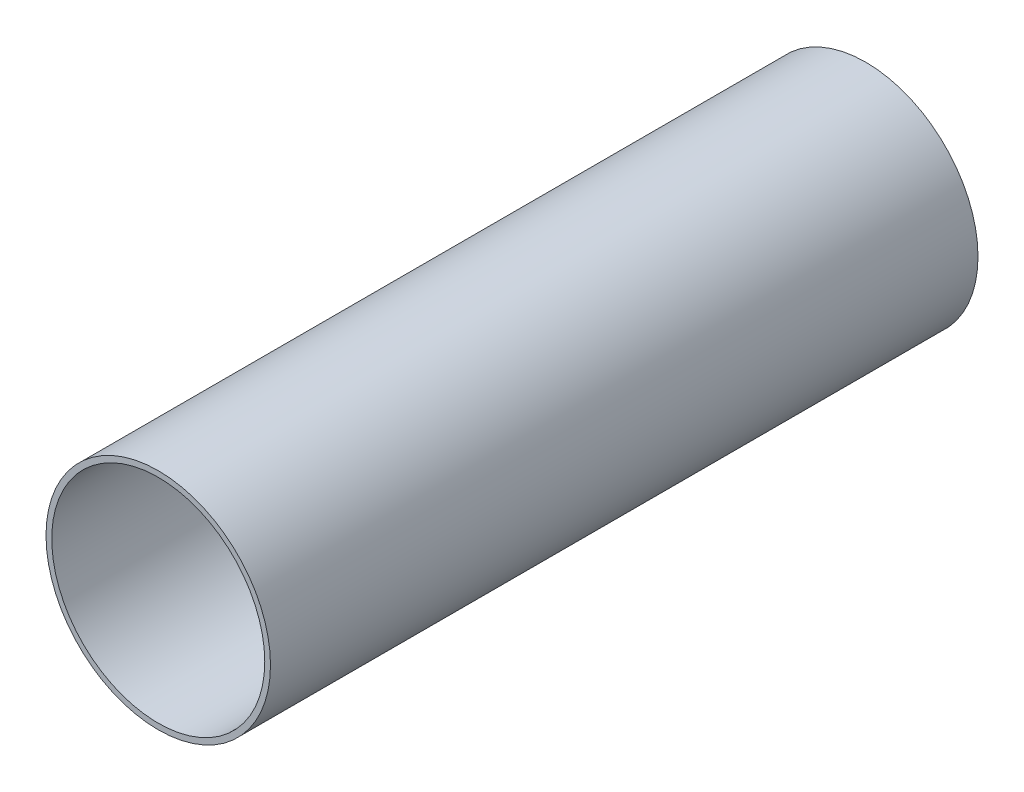
ISO-10303-21;
HEADER;
FILE_DESCRIPTION(('STEP AP214'),'2;1');
FILE_NAME('part.step','',(''),(''),'','','');
FILE_SCHEMA(('AUTOMOTIVE_DESIGN { 1 0 10303 214 1 1 1 1 }'));
ENDSEC;
DATA;
#1=APPLICATION_CONTEXT('core data for automotive mechanical design processes');
#2=APPLICATION_PROTOCOL_DEFINITION('international standard','automotive_design',2000,#1);
#3=PRODUCT_CONTEXT('',#1,'mechanical');
#4=PRODUCT('Part','Part','',(#3));
#5=PRODUCT_RELATED_PRODUCT_CATEGORY('part','',(#4));
#6=PRODUCT_DEFINITION_FORMATION('','',#4);
#7=PRODUCT_DEFINITION_CONTEXT('part definition',#1,'design');
#8=PRODUCT_DEFINITION('design','',#6,#7);
#9=PRODUCT_DEFINITION_SHAPE('','',#8);
#10=(LENGTH_UNIT() NAMED_UNIT(*) SI_UNIT(.MILLI.,.METRE.));
#11=(NAMED_UNIT(*) PLANE_ANGLE_UNIT() SI_UNIT($,.RADIAN.));
#12=(NAMED_UNIT(*) SI_UNIT($,.STERADIAN.) SOLID_ANGLE_UNIT());
#13=UNCERTAINTY_MEASURE_WITH_UNIT(LENGTH_MEASURE(1.E-05),#10,'distance_accuracy_value','');
#14=(GEOMETRIC_REPRESENTATION_CONTEXT(3) GLOBAL_UNCERTAINTY_ASSIGNED_CONTEXT((#13)) GLOBAL_UNIT_ASSIGNED_CONTEXT((#10,
#11,#12)) REPRESENTATION_CONTEXT('',''));
#15=CARTESIAN_POINT('',(0.,0.,0.));
#16=DIRECTION('',(0.,0.,1.));
#17=DIRECTION('',(1.,0.,0.));
#18=AXIS2_PLACEMENT_3D('',#15,#16,#17);
#19=CARTESIAN_POINT('',(0.,0.,185.));
#20=DIRECTION('',(0.,0.,1.));
#21=DIRECTION('',(1.,0.,0.));
#22=AXIS2_PLACEMENT_3D('',#19,#20,#21);
#23=PLANE('',#22);
#24=CARTESIAN_POINT('',(0.,0.,185.));
#25=DIRECTION('',(0.,0.,1.));
#26=DIRECTION('',(1.,0.,0.));
#27=AXIS2_PLACEMENT_3D('',#24,#25,#26);
#28=CIRCLE('',#27,29.35);
#29=CARTESIAN_POINT('',(29.35,0.,185.));
#30=VERTEX_POINT('',#29);
#31=EDGE_CURVE('E10',#30,#30,#28,.T.);
#32=ORIENTED_EDGE('',*,*,#31,.T.);
#33=EDGE_LOOP('',(#32));
#34=FACE_BOUND('',#33,.T.);
#35=CARTESIAN_POINT('',(0.,0.,185.));
#36=DIRECTION('',(0.,0.,1.));
#37=DIRECTION('',(1.,0.,0.));
#38=AXIS2_PLACEMENT_3D('',#35,#36,#37);
#39=CIRCLE('',#38,27.85);
#40=CARTESIAN_POINT('',(27.85,0.,185.));
#41=VERTEX_POINT('',#40);
#42=EDGE_CURVE('E47',#41,#41,#39,.T.);
#43=ORIENTED_EDGE('',*,*,#42,.F.);
#44=EDGE_LOOP('',(#43));
#45=FACE_BOUND('',#44,.T.);
#46=ADVANCED_FACE('F36',(#34,#45),#23,.T.);
#47=CARTESIAN_POINT('',(0.,0.,0.));
#48=DIRECTION('',(0.,0.,1.));
#49=DIRECTION('',(1.,0.,0.));
#50=AXIS2_PLACEMENT_3D('',#47,#48,#49);
#51=PLANE('',#50);
#52=CARTESIAN_POINT('',(0.,0.,0.));
#53=DIRECTION('',(0.,0.,1.));
#54=DIRECTION('',(1.,0.,0.));
#55=AXIS2_PLACEMENT_3D('',#52,#53,#54);
#56=CIRCLE('',#55,29.35);
#57=CARTESIAN_POINT('',(29.35,0.,0.));
#58=VERTEX_POINT('',#57);
#59=EDGE_CURVE('E40',#58,#58,#56,.T.);
#60=ORIENTED_EDGE('',*,*,#59,.F.);
#61=EDGE_LOOP('',(#60));
#62=FACE_BOUND('',#61,.T.);
#63=CARTESIAN_POINT('',(0.,0.,0.));
#64=DIRECTION('',(0.,0.,1.));
#65=DIRECTION('',(1.,0.,0.));
#66=AXIS2_PLACEMENT_3D('',#63,#64,#65);
#67=CIRCLE('',#66,27.85);
#68=CARTESIAN_POINT('',(27.85,0.,0.));
#69=VERTEX_POINT('',#68);
#70=EDGE_CURVE('E49',#69,#69,#67,.T.);
#71=ORIENTED_EDGE('',*,*,#70,.T.);
#72=EDGE_LOOP('',(#71));
#73=FACE_BOUND('',#72,.T.);
#74=ADVANCED_FACE('F59',(#62,#73),#51,.F.);
#75=CARTESIAN_POINT('',(0.,0.,185.));
#76=DIRECTION('',(0.,0.,-1.));
#77=DIRECTION('',(-1.,0.,0.));
#78=AXIS2_PLACEMENT_3D('',#75,#76,#77);
#79=CYLINDRICAL_SURFACE('',#78,29.35);
#80=ORIENTED_EDGE('',*,*,#31,.F.);
#81=EDGE_LOOP('',(#80));
#82=FACE_BOUND('',#81,.T.);
#83=ORIENTED_EDGE('',*,*,#59,.T.);
#84=EDGE_LOOP('',(#83));
#85=FACE_BOUND('',#84,.T.);
#86=ADVANCED_FACE('F38',(#82,#85),#79,.T.);
#87=CARTESIAN_POINT('',(0.,0.,185.));
#88=DIRECTION('',(0.,0.,-1.));
#89=DIRECTION('',(-1.,0.,0.));
#90=AXIS2_PLACEMENT_3D('',#87,#88,#89);
#91=CYLINDRICAL_SURFACE('',#90,27.85);
#92=ORIENTED_EDGE('',*,*,#42,.T.);
#93=EDGE_LOOP('',(#92));
#94=FACE_BOUND('',#93,.T.);
#95=ORIENTED_EDGE('',*,*,#70,.F.);
#96=EDGE_LOOP('',(#95));
#97=FACE_BOUND('',#96,.T.);
#98=ADVANCED_FACE('F55',(#94,#97),#91,.F.);
#99=CLOSED_SHELL('',(#46,#74,#86,#98));
#100=MANIFOLD_SOLID_BREP('B2',#99);
#101=ADVANCED_BREP_SHAPE_REPRESENTATION('',(#18,#100),#14);
#102=SHAPE_DEFINITION_REPRESENTATION(#9,#101);
ENDSEC;
END-ISO-10303-21;
